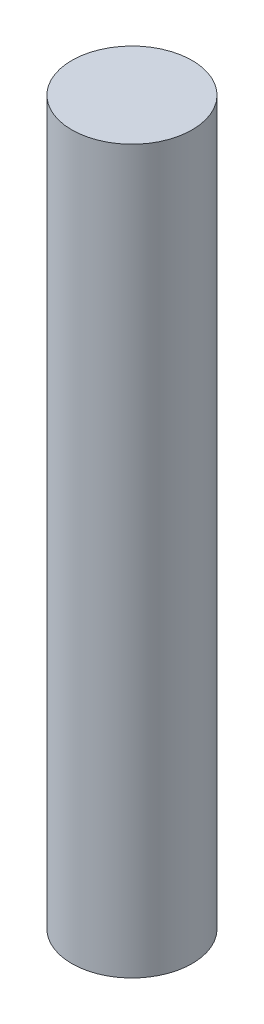
ISO-10303-21;
HEADER;
FILE_DESCRIPTION(('STEP AP214'),'2;1');
FILE_NAME('part.step','',(''),(''),'','','');
FILE_SCHEMA(('AUTOMOTIVE_DESIGN { 1 0 10303 214 1 1 1 1 }'));
ENDSEC;
DATA;
#1=APPLICATION_CONTEXT('core data for automotive mechanical design processes');
#2=APPLICATION_PROTOCOL_DEFINITION('international standard','automotive_design',2000,#1);
#3=PRODUCT_CONTEXT('',#1,'mechanical');
#4=PRODUCT('Part','Part','',(#3));
#5=PRODUCT_RELATED_PRODUCT_CATEGORY('part','',(#4));
#6=PRODUCT_DEFINITION_FORMATION('','',#4);
#7=PRODUCT_DEFINITION_CONTEXT('part definition',#1,'design');
#8=PRODUCT_DEFINITION('design','',#6,#7);
#9=PRODUCT_DEFINITION_SHAPE('','',#8);
#10=(LENGTH_UNIT() NAMED_UNIT(*) SI_UNIT(.MILLI.,.METRE.));
#11=(NAMED_UNIT(*) PLANE_ANGLE_UNIT() SI_UNIT($,.RADIAN.));
#12=(NAMED_UNIT(*) SI_UNIT($,.STERADIAN.) SOLID_ANGLE_UNIT());
#13=UNCERTAINTY_MEASURE_WITH_UNIT(LENGTH_MEASURE(1.E-05),#10,'distance_accuracy_value','');
#14=(GEOMETRIC_REPRESENTATION_CONTEXT(3) GLOBAL_UNCERTAINTY_ASSIGNED_CONTEXT((#13)) GLOBAL_UNIT_ASSIGNED_CONTEXT((#10,
#11,#12)) REPRESENTATION_CONTEXT('',''));
#15=CARTESIAN_POINT('',(0.,0.,0.));
#16=DIRECTION('',(0.,0.,1.));
#17=DIRECTION('',(1.,0.,0.));
#18=AXIS2_PLACEMENT_3D('',#15,#16,#17);
#19=CARTESIAN_POINT('',(0.,28.575,0.));
#20=DIRECTION('',(0.,-1.,0.));
#21=DIRECTION('',(0.,0.,-1.));
#22=AXIS2_PLACEMENT_3D('',#19,#20,#21);
#23=CYLINDRICAL_SURFACE('',#22,2.38125);
#24=CARTESIAN_POINT('',(0.,28.575,0.));
#25=DIRECTION('',(0.,1.,0.));
#26=DIRECTION('',(0.,0.,1.));
#27=AXIS2_PLACEMENT_3D('',#24,#25,#26);
#28=CIRCLE('',#27,2.38125);
#29=CARTESIAN_POINT('',(0.,28.575,2.38125));
#30=VERTEX_POINT('',#29);
#31=EDGE_CURVE('E10',#30,#30,#28,.T.);
#32=ORIENTED_EDGE('',*,*,#31,.F.);
#33=EDGE_LOOP('',(#32));
#34=FACE_BOUND('',#33,.T.);
#35=CARTESIAN_POINT('',(0.,0.,0.));
#36=DIRECTION('',(0.,1.,0.));
#37=DIRECTION('',(0.,0.,1.));
#38=AXIS2_PLACEMENT_3D('',#35,#36,#37);
#39=CIRCLE('',#38,2.38125);
#40=CARTESIAN_POINT('',(0.,0.,2.38125));
#41=VERTEX_POINT('',#40);
#42=EDGE_CURVE('E36',#41,#41,#39,.T.);
#43=ORIENTED_EDGE('',*,*,#42,.T.);
#44=EDGE_LOOP('',(#43));
#45=FACE_BOUND('',#44,.T.);
#46=ADVANCED_FACE('F33',(#34,#45),#23,.T.);
#47=CARTESIAN_POINT('',(0.,28.575,0.));
#48=DIRECTION('',(0.,1.,0.));
#49=DIRECTION('',(0.,0.,1.));
#50=AXIS2_PLACEMENT_3D('',#47,#48,#49);
#51=PLANE('',#50);
#52=ORIENTED_EDGE('',*,*,#31,.T.);
#53=EDGE_LOOP('',(#52));
#54=FACE_BOUND('',#53,.T.);
#55=ADVANCED_FACE('F48',(#54),#51,.T.);
#56=CARTESIAN_POINT('',(0.,0.,0.));
#57=DIRECTION('',(0.,1.,0.));
#58=DIRECTION('',(0.,0.,1.));
#59=AXIS2_PLACEMENT_3D('',#56,#57,#58);
#60=PLANE('',#59);
#61=ORIENTED_EDGE('',*,*,#42,.F.);
#62=EDGE_LOOP('',(#61));
#63=FACE_BOUND('',#62,.T.);
#64=ADVANCED_FACE('F46',(#63),#60,.F.);
#65=CLOSED_SHELL('',(#46,#55,#64));
#66=MANIFOLD_SOLID_BREP('B2',#65);
#67=ADVANCED_BREP_SHAPE_REPRESENTATION('',(#18,#66),#14);
#68=SHAPE_DEFINITION_REPRESENTATION(#9,#67);
ENDSEC;
END-ISO-10303-21;
